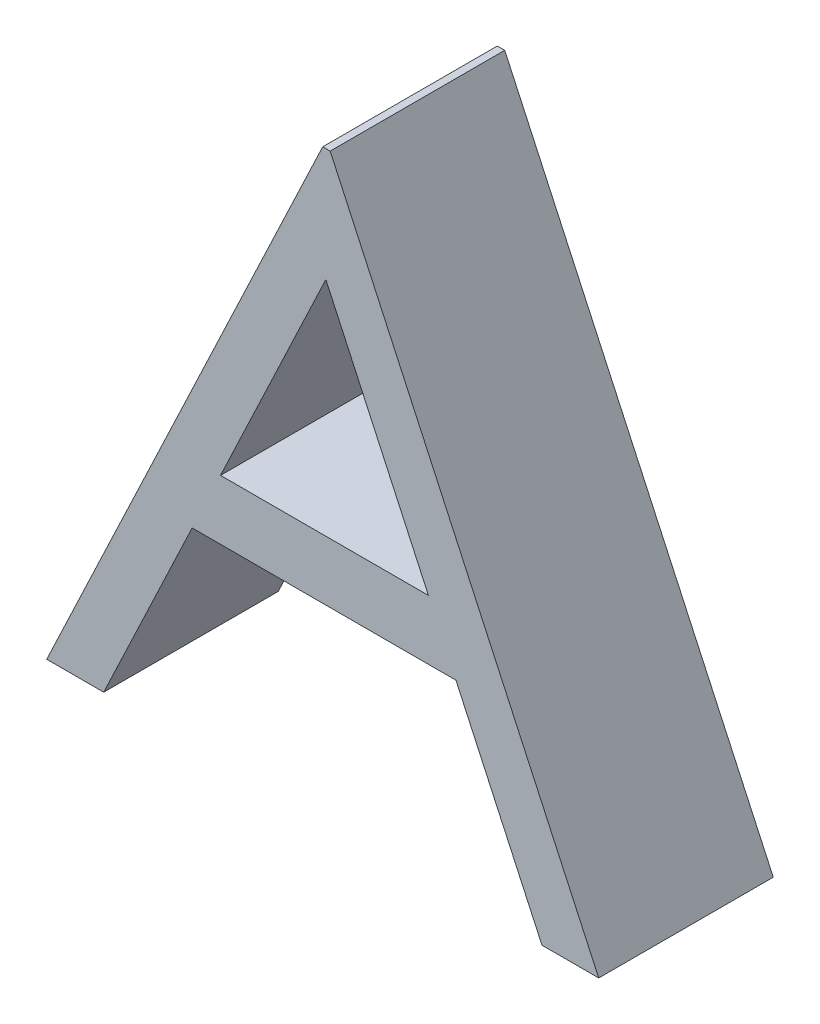
ISO-10303-21;
HEADER;
FILE_DESCRIPTION(('STEP AP214'),'2;1');
FILE_NAME('part.step','',(''),(''),'','','');
FILE_SCHEMA(('AUTOMOTIVE_DESIGN { 1 0 10303 214 1 1 1 1 }'));
ENDSEC;
DATA;
#1=APPLICATION_CONTEXT('core data for automotive mechanical design processes');
#2=APPLICATION_PROTOCOL_DEFINITION('international standard','automotive_design',2000,#1);
#3=PRODUCT_CONTEXT('',#1,'mechanical');
#4=PRODUCT('Part','Part','',(#3));
#5=PRODUCT_RELATED_PRODUCT_CATEGORY('part','',(#4));
#6=PRODUCT_DEFINITION_FORMATION('','',#4);
#7=PRODUCT_DEFINITION_CONTEXT('part definition',#1,'design');
#8=PRODUCT_DEFINITION('design','',#6,#7);
#9=PRODUCT_DEFINITION_SHAPE('','',#8);
#10=(LENGTH_UNIT() NAMED_UNIT(*) SI_UNIT(.MILLI.,.METRE.));
#11=(NAMED_UNIT(*) PLANE_ANGLE_UNIT() SI_UNIT($,.RADIAN.));
#12=(NAMED_UNIT(*) SI_UNIT($,.STERADIAN.) SOLID_ANGLE_UNIT());
#13=UNCERTAINTY_MEASURE_WITH_UNIT(LENGTH_MEASURE(1.E-05),#10,'distance_accuracy_value','');
#14=(GEOMETRIC_REPRESENTATION_CONTEXT(3) GLOBAL_UNCERTAINTY_ASSIGNED_CONTEXT((#13)) GLOBAL_UNIT_ASSIGNED_CONTEXT((#10,
#11,#12)) REPRESENTATION_CONTEXT('',''));
#15=CARTESIAN_POINT('',(0.,0.,0.));
#16=DIRECTION('',(0.,0.,1.));
#17=DIRECTION('',(1.,0.,0.));
#18=AXIS2_PLACEMENT_3D('',#15,#16,#17);
#19=CARTESIAN_POINT('',(0.,0.,1.5));
#20=DIRECTION('',(0.,0.,1.));
#21=DIRECTION('',(1.,0.,0.));
#22=AXIS2_PLACEMENT_3D('',#19,#20,#21);
#23=PLANE('',#22);
#24=DIRECTION('',(1.,0.,0.));
#25=VECTOR('',#24,1.);
#26=CARTESIAN_POINT('',(-53.44528583869,-17.8701190762308,1.5));
#27=LINE('',#26,#25);
#28=CARTESIAN_POINT('',(-53.44528583869,-17.8701190762308,1.5));
#29=VERTEX_POINT('',#28);
#30=CARTESIAN_POINT('',(-53.3811832745875,-17.8701190762308,1.5));
#31=VERTEX_POINT('',#30);
#32=EDGE_CURVE('E144',#29,#31,#27,.T.);
#33=ORIENTED_EDGE('',*,*,#32,.F.);
#34=DIRECTION('',(0.428584206872172,0.903501841514311,0.));
#35=VECTOR('',#34,1.);
#36=CARTESIAN_POINT('',(-55.8170807104849,-22.8701190762308,1.5));
#37=LINE('',#36,#35);
#38=CARTESIAN_POINT('',(-55.8170807104849,-22.8701190762308,1.5));
#39=VERTEX_POINT('',#38);
#40=EDGE_CURVE('E166',#39,#29,#37,.T.);
#41=ORIENTED_EDGE('',*,*,#40,.F.);
#42=DIRECTION('',(-1.,0.,0.));
#43=VECTOR('',#42,1.);
#44=CARTESIAN_POINT('',(-55.3272970566388,-22.8701190762308,1.5));
#45=LINE('',#44,#43);
#46=CARTESIAN_POINT('',(-55.3272970566388,-22.8701190762308,1.5));
#47=VERTEX_POINT('',#46);
#48=EDGE_CURVE('E163',#47,#39,#45,.T.);
#49=ORIENTED_EDGE('',*,*,#48,.F.);
#50=DIRECTION('',(-0.428596026355542,-0.903496234741595,0.));
#51=VECTOR('',#50,1.);
#52=CARTESIAN_POINT('',(-54.5670807104849,-21.2675549736667,1.5));
#53=LINE('',#52,#51);
#54=CARTESIAN_POINT('',(-54.5670807104849,-21.2675549736667,1.5));
#55=VERTEX_POINT('',#54);
#56=EDGE_CURVE('E160',#55,#47,#53,.T.);
#57=ORIENTED_EDGE('',*,*,#56,.F.);
#58=DIRECTION('',(-1.,0.,0.));
#59=VECTOR('',#58,1.);
#60=CARTESIAN_POINT('',(-52.3004541079208,-21.2675549736667,1.5));
#61=LINE('',#60,#59);
#62=CARTESIAN_POINT('',(-52.3004541079208,-21.2675549736667,1.5));
#63=VERTEX_POINT('',#62);
#64=EDGE_CURVE('E157',#63,#55,#61,.T.);
#65=ORIENTED_EDGE('',*,*,#64,.F.);
#66=DIRECTION('',(-0.41884222474461,0.908059023836549,0.));
#67=VECTOR('',#66,1.);
#68=CARTESIAN_POINT('',(-51.5612714156131,-22.8701190762308,1.5));
#69=LINE('',#68,#67);
#70=CARTESIAN_POINT('',(-51.5612714156131,-22.8701190762308,1.5));
#71=VERTEX_POINT('',#70);
#72=EDGE_CURVE('E154',#71,#63,#69,.T.);
#73=ORIENTED_EDGE('',*,*,#72,.F.);
#74=DIRECTION('',(-1.,0.,0.));
#75=VECTOR('',#74,1.);
#76=CARTESIAN_POINT('',(-51.0734909668952,-22.8701190762308,1.5));
#77=LINE('',#76,#75);
#78=CARTESIAN_POINT('',(-51.0734909668952,-22.8701190762308,1.5));
#79=VERTEX_POINT('',#78);
#80=EDGE_CURVE('E151',#79,#71,#77,.T.);
#81=ORIENTED_EDGE('',*,*,#80,.F.);
#82=DIRECTION('',(0.419058177461746,-0.907959384500452,0.));
#83=VECTOR('',#82,1.);
#84=CARTESIAN_POINT('',(-53.3811832745875,-17.8701190762308,1.5));
#85=LINE('',#84,#83);
#86=EDGE_CURVE('E147',#31,#79,#85,.T.);
#87=ORIENTED_EDGE('',*,*,#86,.F.);
#88=EDGE_LOOP('',(#33,#41,#49,#57,#65,#73,#81,#87));
#89=FACE_BOUND('',#88,.T.);
#90=DIRECTION('',(-0.428351119156279,-0.903612371936973,0.));
#91=VECTOR('',#90,1.);
#92=CARTESIAN_POINT('',(-53.4182425694593,-18.8446783711026,1.5));
#93=LINE('',#92,#91);
#94=CARTESIAN_POINT('',(-53.4182425694593,-18.8446783711026,1.5));
#95=VERTEX_POINT('',#94);
#96=CARTESIAN_POINT('',(-54.323691287408,-20.7547344608462,1.5));
#97=VERTEX_POINT('',#96);
#98=EDGE_CURVE('E125',#95,#97,#93,.T.);
#99=ORIENTED_EDGE('',*,*,#98,.F.);
#100=DIRECTION('',(-0.418997788826977,0.907987253742091,0.));
#101=VECTOR('',#100,1.);
#102=CARTESIAN_POINT('',(-52.536832313049,-20.7547344608462,1.5));
#103=LINE('',#102,#101);
#104=CARTESIAN_POINT('',(-52.536832313049,-20.7547344608462,1.5));
#105=VERTEX_POINT('',#104);
#106=EDGE_CURVE('E117',#105,#95,#103,.T.);
#107=ORIENTED_EDGE('',*,*,#106,.F.);
#108=DIRECTION('',(1.,0.,0.));
#109=VECTOR('',#108,1.);
#110=CARTESIAN_POINT('',(-54.323691287408,-20.7547344608462,1.5));
#111=LINE('',#110,#109);
#112=EDGE_CURVE('E134',#97,#105,#111,.T.);
#113=ORIENTED_EDGE('',*,*,#112,.F.);
#114=EDGE_LOOP('',(#99,#107,#113));
#115=FACE_BOUND('',#114,.T.);
#116=ADVANCED_FACE('F33',(#89,#115),#23,.T.);
#117=CARTESIAN_POINT('',(0.,0.,0.));
#118=DIRECTION('',(0.,0.,1.));
#119=DIRECTION('',(1.,0.,0.));
#120=AXIS2_PLACEMENT_3D('',#117,#118,#119);
#121=PLANE('',#120);
#122=DIRECTION('',(1.,0.,0.));
#123=VECTOR('',#122,1.);
#124=CARTESIAN_POINT('',(-53.44528583869,-17.8701190762308,0.));
#125=LINE('',#124,#123);
#126=CARTESIAN_POINT('',(-53.44528583869,-17.8701190762308,0.));
#127=VERTEX_POINT('',#126);
#128=CARTESIAN_POINT('',(-53.3811832745875,-17.8701190762308,0.));
#129=VERTEX_POINT('',#128);
#130=EDGE_CURVE('E132',#127,#129,#125,.T.);
#131=ORIENTED_EDGE('',*,*,#130,.T.);
#132=DIRECTION('',(0.419058177461746,-0.907959384500452,0.));
#133=VECTOR('',#132,1.);
#134=CARTESIAN_POINT('',(-53.3811832745875,-17.8701190762308,0.));
#135=LINE('',#134,#133);
#136=CARTESIAN_POINT('',(-51.0734909668952,-22.8701190762308,0.));
#137=VERTEX_POINT('',#136);
#138=EDGE_CURVE('E171',#129,#137,#135,.T.);
#139=ORIENTED_EDGE('',*,*,#138,.T.);
#140=DIRECTION('',(-1.,0.,0.));
#141=VECTOR('',#140,1.);
#142=CARTESIAN_POINT('',(-51.0734909668952,-22.8701190762308,0.));
#143=LINE('',#142,#141);
#144=CARTESIAN_POINT('',(-51.5612714156131,-22.8701190762308,0.));
#145=VERTEX_POINT('',#144);
#146=EDGE_CURVE('E174',#137,#145,#143,.T.);
#147=ORIENTED_EDGE('',*,*,#146,.T.);
#148=DIRECTION('',(-0.41884222474461,0.908059023836549,0.));
#149=VECTOR('',#148,1.);
#150=CARTESIAN_POINT('',(-51.5612714156131,-22.8701190762308,0.));
#151=LINE('',#150,#149);
#152=CARTESIAN_POINT('',(-52.3004541079208,-21.2675549736667,0.));
#153=VERTEX_POINT('',#152);
#154=EDGE_CURVE('E177',#145,#153,#151,.T.);
#155=ORIENTED_EDGE('',*,*,#154,.T.);
#156=DIRECTION('',(-1.,0.,0.));
#157=VECTOR('',#156,1.);
#158=CARTESIAN_POINT('',(-52.3004541079208,-21.2675549736667,0.));
#159=LINE('',#158,#157);
#160=CARTESIAN_POINT('',(-54.5670807104849,-21.2675549736667,0.));
#161=VERTEX_POINT('',#160);
#162=EDGE_CURVE('E180',#153,#161,#159,.T.);
#163=ORIENTED_EDGE('',*,*,#162,.T.);
#164=DIRECTION('',(-0.428596026355542,-0.903496234741595,0.));
#165=VECTOR('',#164,1.);
#166=CARTESIAN_POINT('',(-54.5670807104849,-21.2675549736667,0.));
#167=LINE('',#166,#165);
#168=CARTESIAN_POINT('',(-55.3272970566388,-22.8701190762308,0.));
#169=VERTEX_POINT('',#168);
#170=EDGE_CURVE('E183',#161,#169,#167,.T.);
#171=ORIENTED_EDGE('',*,*,#170,.T.);
#172=DIRECTION('',(-1.,0.,0.));
#173=VECTOR('',#172,1.);
#174=CARTESIAN_POINT('',(-55.3272970566388,-22.8701190762308,0.));
#175=LINE('',#174,#173);
#176=CARTESIAN_POINT('',(-55.8170807104849,-22.8701190762308,0.));
#177=VERTEX_POINT('',#176);
#178=EDGE_CURVE('E186',#169,#177,#175,.T.);
#179=ORIENTED_EDGE('',*,*,#178,.T.);
#180=DIRECTION('',(0.428584206872172,0.903501841514311,0.));
#181=VECTOR('',#180,1.);
#182=CARTESIAN_POINT('',(-55.8170807104849,-22.8701190762308,0.));
#183=LINE('',#182,#181);
#184=EDGE_CURVE('E148',#177,#127,#183,.T.);
#185=ORIENTED_EDGE('',*,*,#184,.T.);
#186=EDGE_LOOP('',(#131,#139,#147,#155,#163,#171,#179,#185));
#187=FACE_BOUND('',#186,.T.);
#188=DIRECTION('',(-0.418997788826977,0.907987253742091,0.));
#189=VECTOR('',#188,1.);
#190=CARTESIAN_POINT('',(-52.536832313049,-20.7547344608462,0.));
#191=LINE('',#190,#189);
#192=CARTESIAN_POINT('',(-52.536832313049,-20.7547344608462,0.));
#193=VERTEX_POINT('',#192);
#194=CARTESIAN_POINT('',(-53.4182425694593,-18.8446783711026,0.));
#195=VERTEX_POINT('',#194);
#196=EDGE_CURVE('E58',#193,#195,#191,.T.);
#197=ORIENTED_EDGE('',*,*,#196,.T.);
#198=DIRECTION('',(-0.428351119156279,-0.903612371936973,0.));
#199=VECTOR('',#198,1.);
#200=CARTESIAN_POINT('',(-53.4182425694593,-18.8446783711026,0.));
#201=LINE('',#200,#199);
#202=CARTESIAN_POINT('',(-54.323691287408,-20.7547344608462,0.));
#203=VERTEX_POINT('',#202);
#204=EDGE_CURVE('E131',#195,#203,#201,.T.);
#205=ORIENTED_EDGE('',*,*,#204,.T.);
#206=DIRECTION('',(1.,0.,0.));
#207=VECTOR('',#206,1.);
#208=CARTESIAN_POINT('',(-54.323691287408,-20.7547344608462,0.));
#209=LINE('',#208,#207);
#210=EDGE_CURVE('E126',#203,#193,#209,.T.);
#211=ORIENTED_EDGE('',*,*,#210,.T.);
#212=EDGE_LOOP('',(#197,#205,#211));
#213=FACE_BOUND('',#212,.T.);
#214=ADVANCED_FACE('F209',(#187,#213),#121,.F.);
#215=CARTESIAN_POINT('',(-53.44528583869,-17.8701190762308,1.5));
#216=DIRECTION('',(0.,1.,0.));
#217=DIRECTION('',(0.,0.,1.));
#218=AXIS2_PLACEMENT_3D('',#215,#216,#217);
#219=PLANE('',#218);
#220=ORIENTED_EDGE('',*,*,#130,.F.);
#221=DIRECTION('',(0.,0.,-1.));
#222=VECTOR('',#221,1.);
#223=CARTESIAN_POINT('',(-53.44528583869,-17.8701190762308,1.5));
#224=LINE('',#223,#222);
#225=EDGE_CURVE('E11',#29,#127,#224,.T.);
#226=ORIENTED_EDGE('',*,*,#225,.F.);
#227=ORIENTED_EDGE('',*,*,#32,.T.);
#228=DIRECTION('',(0.,0.,-1.));
#229=VECTOR('',#228,1.);
#230=CARTESIAN_POINT('',(-53.3811832745875,-17.8701190762308,1.5));
#231=LINE('',#230,#229);
#232=EDGE_CURVE('E37',#31,#129,#231,.T.);
#233=ORIENTED_EDGE('',*,*,#232,.T.);
#234=EDGE_LOOP('',(#220,#226,#227,#233));
#235=FACE_BOUND('',#234,.T.);
#236=ADVANCED_FACE('F35',(#235),#219,.T.);
#237=CARTESIAN_POINT('',(-55.8170807104849,-22.8701190762308,1.5));
#238=DIRECTION('',(-0.903501841514311,0.428584206872172,0.));
#239=DIRECTION('',(-0.428584206872172,-0.903501841514311,0.));
#240=AXIS2_PLACEMENT_3D('',#237,#238,#239);
#241=PLANE('',#240);
#242=ORIENTED_EDGE('',*,*,#184,.F.);
#243=DIRECTION('',(0.,0.,-1.));
#244=VECTOR('',#243,1.);
#245=CARTESIAN_POINT('',(-55.8170807104849,-22.8701190762308,1.5));
#246=LINE('',#245,#244);
#247=EDGE_CURVE('E42',#39,#177,#246,.T.);
#248=ORIENTED_EDGE('',*,*,#247,.F.);
#249=ORIENTED_EDGE('',*,*,#40,.T.);
#250=ORIENTED_EDGE('',*,*,#225,.T.);
#251=EDGE_LOOP('',(#242,#248,#249,#250));
#252=FACE_BOUND('',#251,.T.);
#253=ADVANCED_FACE('F214',(#252),#241,.T.);
#254=CARTESIAN_POINT('',(-55.3272970566388,-22.8701190762308,1.5));
#255=DIRECTION('',(0.,-1.,0.));
#256=DIRECTION('',(0.,0.,-1.));
#257=AXIS2_PLACEMENT_3D('',#254,#255,#256);
#258=PLANE('',#257);
#259=ORIENTED_EDGE('',*,*,#178,.F.);
#260=DIRECTION('',(0.,0.,-1.));
#261=VECTOR('',#260,1.);
#262=CARTESIAN_POINT('',(-55.3272970566388,-22.8701190762308,1.5));
#263=LINE('',#262,#261);
#264=EDGE_CURVE('E192',#47,#169,#263,.T.);
#265=ORIENTED_EDGE('',*,*,#264,.F.);
#266=ORIENTED_EDGE('',*,*,#48,.T.);
#267=ORIENTED_EDGE('',*,*,#247,.T.);
#268=EDGE_LOOP('',(#259,#265,#266,#267));
#269=FACE_BOUND('',#268,.T.);
#270=ADVANCED_FACE('F234',(#269),#258,.T.);
#271=CARTESIAN_POINT('',(-54.5670807104849,-21.2675549736667,1.5));
#272=DIRECTION('',(0.903496234741595,-0.428596026355542,0.));
#273=DIRECTION('',(0.428596026355542,0.903496234741595,0.));
#274=AXIS2_PLACEMENT_3D('',#271,#272,#273);
#275=PLANE('',#274);
#276=ORIENTED_EDGE('',*,*,#170,.F.);
#277=DIRECTION('',(0.,0.,-1.));
#278=VECTOR('',#277,1.);
#279=CARTESIAN_POINT('',(-54.5670807104849,-21.2675549736667,1.5));
#280=LINE('',#279,#278);
#281=EDGE_CURVE('E194',#55,#161,#280,.T.);
#282=ORIENTED_EDGE('',*,*,#281,.F.);
#283=ORIENTED_EDGE('',*,*,#56,.T.);
#284=ORIENTED_EDGE('',*,*,#264,.T.);
#285=EDGE_LOOP('',(#276,#282,#283,#284));
#286=FACE_BOUND('',#285,.T.);
#287=ADVANCED_FACE('F232',(#286),#275,.T.);
#288=CARTESIAN_POINT('',(-52.3004541079208,-21.2675549736667,1.5));
#289=DIRECTION('',(0.,-1.,0.));
#290=DIRECTION('',(0.,0.,-1.));
#291=AXIS2_PLACEMENT_3D('',#288,#289,#290);
#292=PLANE('',#291);
#293=ORIENTED_EDGE('',*,*,#162,.F.);
#294=DIRECTION('',(0.,0.,-1.));
#295=VECTOR('',#294,1.);
#296=CARTESIAN_POINT('',(-52.3004541079208,-21.2675549736667,1.5));
#297=LINE('',#296,#295);
#298=EDGE_CURVE('E196',#63,#153,#297,.T.);
#299=ORIENTED_EDGE('',*,*,#298,.F.);
#300=ORIENTED_EDGE('',*,*,#64,.T.);
#301=ORIENTED_EDGE('',*,*,#281,.T.);
#302=EDGE_LOOP('',(#293,#299,#300,#301));
#303=FACE_BOUND('',#302,.T.);
#304=ADVANCED_FACE('F228',(#303),#292,.T.);
#305=CARTESIAN_POINT('',(-51.5612714156131,-22.8701190762308,1.5));
#306=DIRECTION('',(-0.908059023836549,-0.418842224744609,0.));
#307=DIRECTION('',(0.41884222474461,-0.908059023836549,0.));
#308=AXIS2_PLACEMENT_3D('',#305,#306,#307);
#309=PLANE('',#308);
#310=ORIENTED_EDGE('',*,*,#154,.F.);
#311=DIRECTION('',(0.,0.,-1.));
#312=VECTOR('',#311,1.);
#313=CARTESIAN_POINT('',(-51.5612714156131,-22.8701190762308,1.5));
#314=LINE('',#313,#312);
#315=EDGE_CURVE('E198',#71,#145,#314,.T.);
#316=ORIENTED_EDGE('',*,*,#315,.F.);
#317=ORIENTED_EDGE('',*,*,#72,.T.);
#318=ORIENTED_EDGE('',*,*,#298,.T.);
#319=EDGE_LOOP('',(#310,#316,#317,#318));
#320=FACE_BOUND('',#319,.T.);
#321=ADVANCED_FACE('F226',(#320),#309,.T.);
#322=CARTESIAN_POINT('',(-51.0734909668952,-22.8701190762308,1.5));
#323=DIRECTION('',(0.,-1.,0.));
#324=DIRECTION('',(0.,0.,-1.));
#325=AXIS2_PLACEMENT_3D('',#322,#323,#324);
#326=PLANE('',#325);
#327=ORIENTED_EDGE('',*,*,#146,.F.);
#328=DIRECTION('',(0.,0.,-1.));
#329=VECTOR('',#328,1.);
#330=CARTESIAN_POINT('',(-51.0734909668952,-22.8701190762308,1.5));
#331=LINE('',#330,#329);
#332=EDGE_CURVE('E199',#79,#137,#331,.T.);
#333=ORIENTED_EDGE('',*,*,#332,.F.);
#334=ORIENTED_EDGE('',*,*,#80,.T.);
#335=ORIENTED_EDGE('',*,*,#315,.T.);
#336=EDGE_LOOP('',(#327,#333,#334,#335));
#337=FACE_BOUND('',#336,.T.);
#338=ADVANCED_FACE('F222',(#337),#326,.T.);
#339=CARTESIAN_POINT('',(-53.3811832745875,-17.8701190762308,1.5));
#340=DIRECTION('',(0.907959384500452,0.419058177461746,0.));
#341=DIRECTION('',(-0.419058177461746,0.907959384500452,0.));
#342=AXIS2_PLACEMENT_3D('',#339,#340,#341);
#343=PLANE('',#342);
#344=ORIENTED_EDGE('',*,*,#138,.F.);
#345=ORIENTED_EDGE('',*,*,#232,.F.);
#346=ORIENTED_EDGE('',*,*,#86,.T.);
#347=ORIENTED_EDGE('',*,*,#332,.T.);
#348=EDGE_LOOP('',(#344,#345,#346,#347));
#349=FACE_BOUND('',#348,.T.);
#350=ADVANCED_FACE('F207',(#349),#343,.T.);
#351=CARTESIAN_POINT('',(-52.536832313049,-20.7547344608462,1.5));
#352=DIRECTION('',(-0.907987253742091,-0.418997788826977,0.));
#353=DIRECTION('',(0.418997788826977,-0.907987253742091,0.));
#354=AXIS2_PLACEMENT_3D('',#351,#352,#353);
#355=PLANE('',#354);
#356=ORIENTED_EDGE('',*,*,#196,.F.);
#357=DIRECTION('',(0.,0.,-1.));
#358=VECTOR('',#357,1.);
#359=CARTESIAN_POINT('',(-52.536832313049,-20.7547344608462,1.5));
#360=LINE('',#359,#358);
#361=EDGE_CURVE('E121',#105,#193,#360,.T.);
#362=ORIENTED_EDGE('',*,*,#361,.F.);
#363=ORIENTED_EDGE('',*,*,#106,.T.);
#364=DIRECTION('',(0.,0.,-1.));
#365=VECTOR('',#364,1.);
#366=CARTESIAN_POINT('',(-53.4182425694593,-18.8446783711026,1.5));
#367=LINE('',#366,#365);
#368=EDGE_CURVE('E120',#95,#195,#367,.T.);
#369=ORIENTED_EDGE('',*,*,#368,.T.);
#370=EDGE_LOOP('',(#356,#362,#363,#369));
#371=FACE_BOUND('',#370,.T.);
#372=ADVANCED_FACE('F119',(#371),#355,.T.);
#373=CARTESIAN_POINT('',(-53.4182425694593,-18.8446783711026,1.5));
#374=DIRECTION('',(0.903612371936973,-0.428351119156279,0.));
#375=DIRECTION('',(0.428351119156279,0.903612371936974,0.));
#376=AXIS2_PLACEMENT_3D('',#373,#374,#375);
#377=PLANE('',#376);
#378=ORIENTED_EDGE('',*,*,#204,.F.);
#379=ORIENTED_EDGE('',*,*,#368,.F.);
#380=ORIENTED_EDGE('',*,*,#98,.T.);
#381=DIRECTION('',(0.,0.,-1.));
#382=VECTOR('',#381,1.);
#383=CARTESIAN_POINT('',(-54.323691287408,-20.7547344608462,1.5));
#384=LINE('',#383,#382);
#385=EDGE_CURVE('E50',#97,#203,#384,.T.);
#386=ORIENTED_EDGE('',*,*,#385,.T.);
#387=EDGE_LOOP('',(#378,#379,#380,#386));
#388=FACE_BOUND('',#387,.T.);
#389=ADVANCED_FACE('F129',(#388),#377,.T.);
#390=CARTESIAN_POINT('',(-54.323691287408,-20.7547344608462,1.5));
#391=DIRECTION('',(0.,1.,0.));
#392=DIRECTION('',(0.,0.,1.));
#393=AXIS2_PLACEMENT_3D('',#390,#391,#392);
#394=PLANE('',#393);
#395=ORIENTED_EDGE('',*,*,#210,.F.);
#396=ORIENTED_EDGE('',*,*,#385,.F.);
#397=ORIENTED_EDGE('',*,*,#112,.T.);
#398=ORIENTED_EDGE('',*,*,#361,.T.);
#399=EDGE_LOOP('',(#395,#396,#397,#398));
#400=FACE_BOUND('',#399,.T.);
#401=ADVANCED_FACE('F254',(#400),#394,.T.);
#402=CLOSED_SHELL('',(#116,#214,#236,#253,#270,#287,#304,#321,#338,#350,#372,#389,#401));
#403=MANIFOLD_SOLID_BREP('B2',#402);
#404=ADVANCED_BREP_SHAPE_REPRESENTATION('',(#18,#403),#14);
#405=SHAPE_DEFINITION_REPRESENTATION(#9,#404);
ENDSEC;
END-ISO-10303-21;
